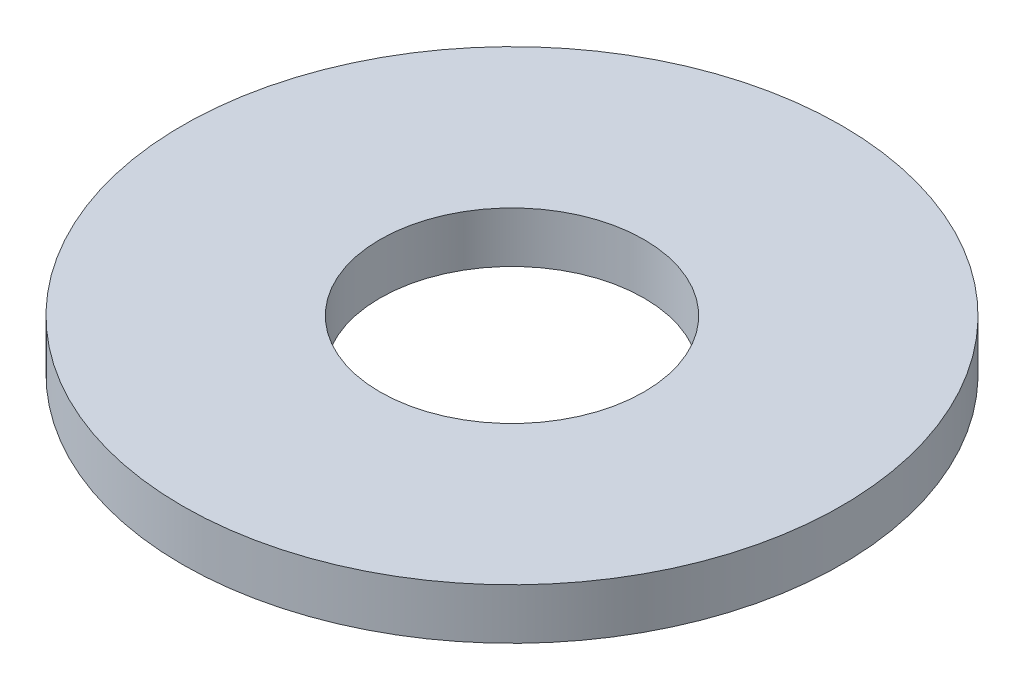
ISO-10303-21;
HEADER;
FILE_DESCRIPTION(('STEP AP214'),'2;1');
FILE_NAME('part.step','',(''),(''),'','','');
FILE_SCHEMA(('AUTOMOTIVE_DESIGN { 1 0 10303 214 1 1 1 1 }'));
ENDSEC;
DATA;
#1=APPLICATION_CONTEXT('core data for automotive mechanical design processes');
#2=APPLICATION_PROTOCOL_DEFINITION('international standard','automotive_design',2000,#1);
#3=PRODUCT_CONTEXT('',#1,'mechanical');
#4=PRODUCT('Part','Part','',(#3));
#5=PRODUCT_RELATED_PRODUCT_CATEGORY('part','',(#4));
#6=PRODUCT_DEFINITION_FORMATION('','',#4);
#7=PRODUCT_DEFINITION_CONTEXT('part definition',#1,'design');
#8=PRODUCT_DEFINITION('design','',#6,#7);
#9=PRODUCT_DEFINITION_SHAPE('','',#8);
#10=(LENGTH_UNIT() NAMED_UNIT(*) SI_UNIT(.MILLI.,.METRE.));
#11=(NAMED_UNIT(*) PLANE_ANGLE_UNIT() SI_UNIT($,.RADIAN.));
#12=(NAMED_UNIT(*) SI_UNIT($,.STERADIAN.) SOLID_ANGLE_UNIT());
#13=UNCERTAINTY_MEASURE_WITH_UNIT(LENGTH_MEASURE(1.E-05),#10,'distance_accuracy_value','');
#14=(GEOMETRIC_REPRESENTATION_CONTEXT(3) GLOBAL_UNCERTAINTY_ASSIGNED_CONTEXT((#13)) GLOBAL_UNIT_ASSIGNED_CONTEXT((#10,
#11,#12)) REPRESENTATION_CONTEXT('',''));
#15=CARTESIAN_POINT('',(0.,0.,0.));
#16=DIRECTION('',(0.,0.,1.));
#17=DIRECTION('',(1.,0.,0.));
#18=AXIS2_PLACEMENT_3D('',#15,#16,#17);
#19=CARTESIAN_POINT('',(0.,0.609600000000002,0.));
#20=DIRECTION('',(0.,1.,0.));
#21=DIRECTION('',(0.,0.,1.));
#22=AXIS2_PLACEMENT_3D('',#19,#20,#21);
#23=PLANE('',#22);
#24=CARTESIAN_POINT('',(0.,0.609600000000002,0.));
#25=DIRECTION('',(0.,1.,0.));
#26=DIRECTION('',(0.,0.,1.));
#27=AXIS2_PLACEMENT_3D('',#24,#25,#26);
#28=CIRCLE('',#27,3.9624);
#29=CARTESIAN_POINT('',(0.,0.609600000000002,3.9624));
#30=VERTEX_POINT('',#29);
#31=EDGE_CURVE('E10',#30,#30,#28,.T.);
#32=ORIENTED_EDGE('',*,*,#31,.T.);
#33=EDGE_LOOP('',(#32));
#34=FACE_BOUND('',#33,.T.);
#35=CARTESIAN_POINT('',(0.,0.609600000000002,0.));
#36=DIRECTION('',(0.,1.,0.));
#37=DIRECTION('',(0.,0.,1.));
#38=AXIS2_PLACEMENT_3D('',#35,#36,#37);
#39=CIRCLE('',#38,1.5875);
#40=CARTESIAN_POINT('',(0.,0.609600000000002,1.5875));
#41=VERTEX_POINT('',#40);
#42=EDGE_CURVE('E46',#41,#41,#39,.T.);
#43=ORIENTED_EDGE('',*,*,#42,.F.);
#44=EDGE_LOOP('',(#43));
#45=FACE_BOUND('',#44,.T.);
#46=ADVANCED_FACE('F35',(#34,#45),#23,.T.);
#47=CARTESIAN_POINT('',(0.,0.,0.));
#48=DIRECTION('',(0.,1.,0.));
#49=DIRECTION('',(0.,0.,1.));
#50=AXIS2_PLACEMENT_3D('',#47,#48,#49);
#51=PLANE('',#50);
#52=CARTESIAN_POINT('',(0.,0.,0.));
#53=DIRECTION('',(0.,1.,0.));
#54=DIRECTION('',(0.,0.,1.));
#55=AXIS2_PLACEMENT_3D('',#52,#53,#54);
#56=CIRCLE('',#55,3.9624);
#57=CARTESIAN_POINT('',(0.,0.,3.9624));
#58=VERTEX_POINT('',#57);
#59=EDGE_CURVE('E39',#58,#58,#56,.T.);
#60=ORIENTED_EDGE('',*,*,#59,.F.);
#61=EDGE_LOOP('',(#60));
#62=FACE_BOUND('',#61,.T.);
#63=CARTESIAN_POINT('',(0.,0.,0.));
#64=DIRECTION('',(0.,1.,0.));
#65=DIRECTION('',(0.,0.,1.));
#66=AXIS2_PLACEMENT_3D('',#63,#64,#65);
#67=CIRCLE('',#66,1.5875);
#68=CARTESIAN_POINT('',(0.,0.,1.5875));
#69=VERTEX_POINT('',#68);
#70=EDGE_CURVE('E48',#69,#69,#67,.T.);
#71=ORIENTED_EDGE('',*,*,#70,.T.);
#72=EDGE_LOOP('',(#71));
#73=FACE_BOUND('',#72,.T.);
#74=ADVANCED_FACE('F58',(#62,#73),#51,.F.);
#75=CARTESIAN_POINT('',(0.,0.609600000000002,0.));
#76=DIRECTION('',(0.,-1.,0.));
#77=DIRECTION('',(0.,0.,-1.));
#78=AXIS2_PLACEMENT_3D('',#75,#76,#77);
#79=CYLINDRICAL_SURFACE('',#78,3.9624);
#80=ORIENTED_EDGE('',*,*,#31,.F.);
#81=EDGE_LOOP('',(#80));
#82=FACE_BOUND('',#81,.T.);
#83=ORIENTED_EDGE('',*,*,#59,.T.);
#84=EDGE_LOOP('',(#83));
#85=FACE_BOUND('',#84,.T.);
#86=ADVANCED_FACE('F37',(#82,#85),#79,.T.);
#87=CARTESIAN_POINT('',(0.,0.609600000000002,0.));
#88=DIRECTION('',(0.,-1.,0.));
#89=DIRECTION('',(0.,0.,-1.));
#90=AXIS2_PLACEMENT_3D('',#87,#88,#89);
#91=CYLINDRICAL_SURFACE('',#90,1.5875);
#92=ORIENTED_EDGE('',*,*,#42,.T.);
#93=EDGE_LOOP('',(#92));
#94=FACE_BOUND('',#93,.T.);
#95=ORIENTED_EDGE('',*,*,#70,.F.);
#96=EDGE_LOOP('',(#95));
#97=FACE_BOUND('',#96,.T.);
#98=ADVANCED_FACE('F54',(#94,#97),#91,.F.);
#99=CLOSED_SHELL('',(#46,#74,#86,#98));
#100=MANIFOLD_SOLID_BREP('B2',#99);
#101=ADVANCED_BREP_SHAPE_REPRESENTATION('',(#18,#100),#14);
#102=SHAPE_DEFINITION_REPRESENTATION(#9,#101);
ENDSEC;
END-ISO-10303-21;
